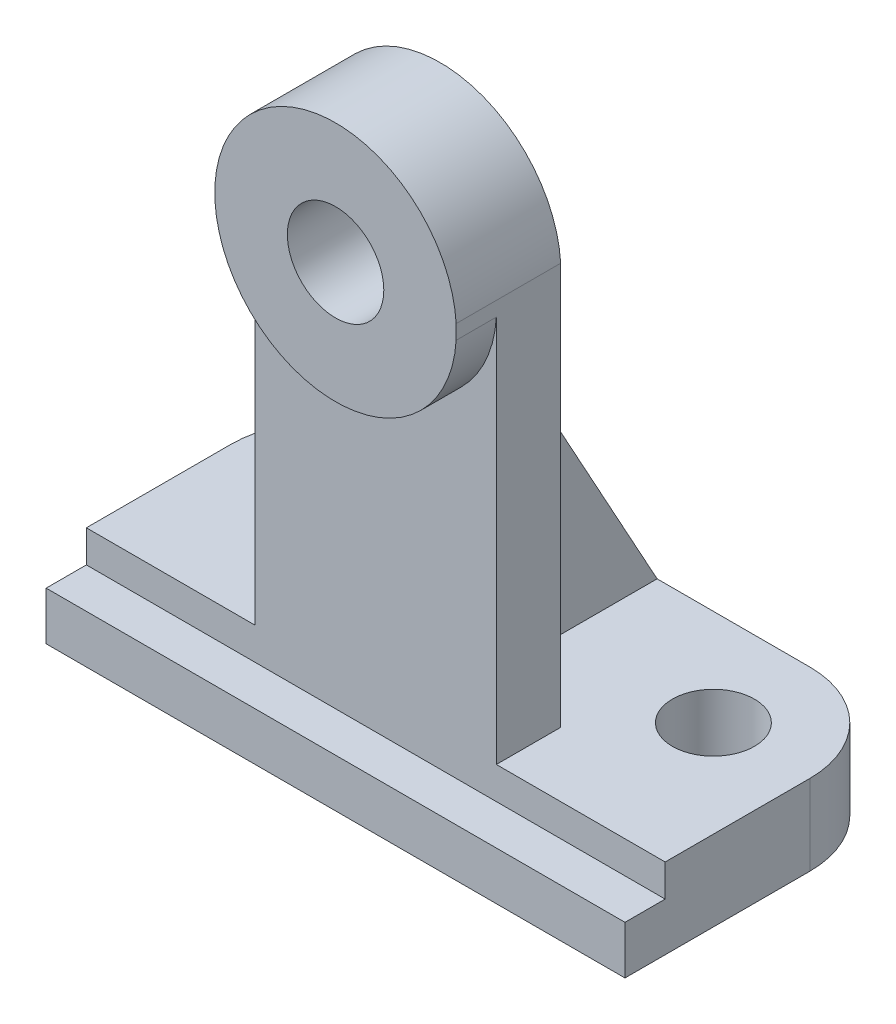
ISO-10303-21;
HEADER;
FILE_DESCRIPTION(('STEP AP214'),'2;1');
FILE_NAME('part.step','',(''),(''),'','','');
FILE_SCHEMA(('AUTOMOTIVE_DESIGN { 1 0 10303 214 1 1 1 1 }'));
ENDSEC;
DATA;
#1=APPLICATION_CONTEXT('core data for automotive mechanical design processes');
#2=APPLICATION_PROTOCOL_DEFINITION('international standard','automotive_design',2000,#1);
#3=PRODUCT_CONTEXT('',#1,'mechanical');
#4=PRODUCT('Part','Part','',(#3));
#5=PRODUCT_RELATED_PRODUCT_CATEGORY('part','',(#4));
#6=PRODUCT_DEFINITION_FORMATION('','',#4);
#7=PRODUCT_DEFINITION_CONTEXT('part definition',#1,'design');
#8=PRODUCT_DEFINITION('design','',#6,#7);
#9=PRODUCT_DEFINITION_SHAPE('','',#8);
#10=(LENGTH_UNIT() NAMED_UNIT(*) SI_UNIT(.MILLI.,.METRE.));
#11=(NAMED_UNIT(*) PLANE_ANGLE_UNIT() SI_UNIT($,.RADIAN.));
#12=(NAMED_UNIT(*) SI_UNIT($,.STERADIAN.) SOLID_ANGLE_UNIT());
#13=UNCERTAINTY_MEASURE_WITH_UNIT(LENGTH_MEASURE(1.E-05),#10,'distance_accuracy_value','');
#14=(GEOMETRIC_REPRESENTATION_CONTEXT(3) GLOBAL_UNCERTAINTY_ASSIGNED_CONTEXT((#13)) GLOBAL_UNIT_ASSIGNED_CONTEXT((#10,
#11,#12)) REPRESENTATION_CONTEXT('',''));
#15=CARTESIAN_POINT('',(0.,0.,0.));
#16=DIRECTION('',(0.,0.,1.));
#17=DIRECTION('',(1.,0.,0.));
#18=AXIS2_PLACEMENT_3D('',#15,#16,#17);
#19=CARTESIAN_POINT('',(-36.,0.,-35.));
#20=DIRECTION('',(0.,1.,0.));
#21=DIRECTION('',(-1.,0.,0.));
#22=AXIS2_PLACEMENT_3D('',#19,#20,#21);
#23=PLANE('',#22);
#24=CARTESIAN_POINT('',(24.,0.,-23.));
#25=DIRECTION('',(0.,1.,0.));
#26=DIRECTION('',(0.,0.,1.));
#27=AXIS2_PLACEMENT_3D('',#24,#25,#26);
#28=CIRCLE('',#27,5.1);
#29=CARTESIAN_POINT('',(24.,0.,-17.9));
#30=VERTEX_POINT('',#29);
#31=EDGE_CURVE('E347',#30,#30,#28,.T.);
#32=ORIENTED_EDGE('',*,*,#31,.F.);
#33=EDGE_LOOP('',(#32));
#34=FACE_BOUND('',#33,.T.);
#35=DIRECTION('',(0.,0.,1.));
#36=VECTOR('',#35,1.);
#37=CARTESIAN_POINT('',(36.,0.,-35.));
#38=LINE('',#37,#36);
#39=CARTESIAN_POINT('',(36.,0.,-22.9999999999999));
#40=VERTEX_POINT('',#39);
#41=CARTESIAN_POINT('',(36.,0.,-5.));
#42=VERTEX_POINT('',#41);
#43=EDGE_CURVE('E55',#40,#42,#38,.T.);
#44=ORIENTED_EDGE('',*,*,#43,.F.);
#45=CARTESIAN_POINT('',(24.,0.,-23.));
#46=DIRECTION('',(0.,1.,0.));
#47=DIRECTION('',(0.,0.,1.));
#48=AXIS2_PLACEMENT_3D('',#45,#46,#47);
#49=CIRCLE('',#48,12.);
#50=CARTESIAN_POINT('',(23.9999999999999,0.,-35.));
#51=VERTEX_POINT('',#50);
#52=EDGE_CURVE('E167',#40,#51,#49,.T.);
#53=ORIENTED_EDGE('',*,*,#52,.T.);
#54=DIRECTION('',(-1.,0.,0.));
#55=VECTOR('',#54,1.);
#56=CARTESIAN_POINT('',(-36.,0.,-35.));
#57=LINE('',#56,#55);
#58=CARTESIAN_POINT('',(5.,0.,-35.));
#59=VERTEX_POINT('',#58);
#60=EDGE_CURVE('E198',#51,#59,#57,.T.);
#61=ORIENTED_EDGE('',*,*,#60,.T.);
#62=DIRECTION('',(0.,0.,1.));
#63=VECTOR('',#62,1.);
#64=CARTESIAN_POINT('',(5.,0.,-35.));
#65=LINE('',#64,#63);
#66=CARTESIAN_POINT('',(5.,0.,-13.));
#67=VERTEX_POINT('',#66);
#68=EDGE_CURVE('E324',#59,#67,#65,.T.);
#69=ORIENTED_EDGE('',*,*,#68,.T.);
#70=DIRECTION('',(1.,0.,0.));
#71=VECTOR('',#70,1.);
#72=CARTESIAN_POINT('',(0.,0.,-13.));
#73=LINE('',#72,#71);
#74=CARTESIAN_POINT('',(15.,0.,-13.));
#75=VERTEX_POINT('',#74);
#76=EDGE_CURVE('E267',#67,#75,#73,.T.);
#77=ORIENTED_EDGE('',*,*,#76,.T.);
#78=DIRECTION('',(0.,0.,1.));
#79=VECTOR('',#78,1.);
#80=CARTESIAN_POINT('',(15.,0.,-13.));
#81=LINE('',#80,#79);
#82=CARTESIAN_POINT('',(15.,0.,-5.));
#83=VERTEX_POINT('',#82);
#84=EDGE_CURVE('E234',#75,#83,#81,.T.);
#85=ORIENTED_EDGE('',*,*,#84,.T.);
#86=DIRECTION('',(1.,0.,0.));
#87=VECTOR('',#86,1.);
#88=CARTESIAN_POINT('',(-36.,0.,-5.));
#89=LINE('',#88,#87);
#90=EDGE_CURVE('E221',#83,#42,#89,.T.);
#91=ORIENTED_EDGE('',*,*,#90,.T.);
#92=EDGE_LOOP('',(#44,#53,#61,#69,#77,#85,#91));
#93=FACE_BOUND('',#92,.T.);
#94=ADVANCED_FACE('F45',(#34,#93),#23,.T.);
#95=CARTESIAN_POINT('',(-36.,-10.,-35.));
#96=DIRECTION('',(-1.,0.,0.));
#97=DIRECTION('',(0.,0.,1.));
#98=AXIS2_PLACEMENT_3D('',#95,#96,#97);
#99=PLANE('',#98);
#100=DIRECTION('',(0.,0.,1.));
#101=VECTOR('',#100,1.);
#102=CARTESIAN_POINT('',(-36.,0.,-35.));
#103=LINE('',#102,#101);
#104=CARTESIAN_POINT('',(-36.,0.,-22.9999999999999));
#105=VERTEX_POINT('',#104);
#106=CARTESIAN_POINT('',(-36.,0.,-5.));
#107=VERTEX_POINT('',#106);
#108=EDGE_CURVE('E12',#105,#107,#103,.T.);
#109=ORIENTED_EDGE('',*,*,#108,.F.);
#110=DIRECTION('',(0.,1.,0.));
#111=VECTOR('',#110,1.);
#112=CARTESIAN_POINT('',(-36.,-10.,-22.9999999999999));
#113=LINE('',#112,#111);
#114=CARTESIAN_POINT('',(-36.,-10.,-22.9999999999999));
#115=VERTEX_POINT('',#114);
#116=EDGE_CURVE('E331',#115,#105,#113,.T.);
#117=ORIENTED_EDGE('',*,*,#116,.F.);
#118=DIRECTION('',(0.,0.,1.));
#119=VECTOR('',#118,1.);
#120=CARTESIAN_POINT('',(-36.,-10.,-35.));
#121=LINE('',#120,#119);
#122=CARTESIAN_POINT('',(-36.,-10.,0.));
#123=VERTEX_POINT('',#122);
#124=EDGE_CURVE('E191',#115,#123,#121,.T.);
#125=ORIENTED_EDGE('',*,*,#124,.T.);
#126=DIRECTION('',(0.,-1.,0.));
#127=VECTOR('',#126,1.);
#128=CARTESIAN_POINT('',(-36.,-10.,0.));
#129=LINE('',#128,#127);
#130=CARTESIAN_POINT('',(-36.,-3.99999999999999,0.));
#131=VERTEX_POINT('',#130);
#132=EDGE_CURVE('E204',#131,#123,#129,.T.);
#133=ORIENTED_EDGE('',*,*,#132,.F.);
#134=DIRECTION('',(0.,0.,-1.));
#135=VECTOR('',#134,1.);
#136=CARTESIAN_POINT('',(-36.,-3.99999999999999,0.));
#137=LINE('',#136,#135);
#138=CARTESIAN_POINT('',(-36.,-3.99999999999999,-5.));
#139=VERTEX_POINT('',#138);
#140=EDGE_CURVE('E229',#131,#139,#137,.T.);
#141=ORIENTED_EDGE('',*,*,#140,.T.);
#142=DIRECTION('',(0.,1.,0.));
#143=VECTOR('',#142,1.);
#144=CARTESIAN_POINT('',(-36.,-3.99999999999999,-5.));
#145=LINE('',#144,#143);
#146=EDGE_CURVE('E218',#139,#107,#145,.T.);
#147=ORIENTED_EDGE('',*,*,#146,.T.);
#148=EDGE_LOOP('',(#109,#117,#125,#133,#141,#147));
#149=FACE_BOUND('',#148,.T.);
#150=ADVANCED_FACE('F47',(#149),#99,.T.);
#151=CARTESIAN_POINT('',(-24.,0.,-23.));
#152=DIRECTION('',(0.,1.,0.));
#153=DIRECTION('',(0.,0.,1.));
#154=AXIS2_PLACEMENT_3D('',#151,#152,#153);
#155=CIRCLE('',#154,5.1);
#156=CARTESIAN_POINT('',(-24.,0.,-17.9));
#157=VERTEX_POINT('',#156);
#158=EDGE_CURVE('E355',#157,#157,#155,.T.);
#159=ORIENTED_EDGE('',*,*,#158,.F.);
#160=EDGE_LOOP('',(#159));
#161=FACE_BOUND('',#160,.T.);
#162=CARTESIAN_POINT('',(-24.,0.,-23.));
#163=DIRECTION('',(0.,1.,0.));
#164=DIRECTION('',(0.,0.,1.));
#165=AXIS2_PLACEMENT_3D('',#162,#163,#164);
#166=CIRCLE('',#165,12.);
#167=CARTESIAN_POINT('',(-23.9999999999999,0.,-35.));
#168=VERTEX_POINT('',#167);
#169=EDGE_CURVE('E71',#105,#168,#166,.F.);
#170=ORIENTED_EDGE('',*,*,#169,.F.);
#171=ORIENTED_EDGE('',*,*,#108,.T.);
#172=CARTESIAN_POINT('',(-15.,0.,-5.));
#173=VERTEX_POINT('',#172);
#174=EDGE_CURVE('E208',#107,#173,#89,.T.);
#175=ORIENTED_EDGE('',*,*,#174,.T.);
#176=DIRECTION('',(0.,0.,1.));
#177=VECTOR('',#176,1.);
#178=CARTESIAN_POINT('',(-15.,0.,-13.));
#179=LINE('',#178,#177);
#180=CARTESIAN_POINT('',(-15.,0.,-13.));
#181=VERTEX_POINT('',#180);
#182=EDGE_CURVE('E241',#181,#173,#179,.T.);
#183=ORIENTED_EDGE('',*,*,#182,.F.);
#184=CARTESIAN_POINT('',(-5.,0.,-13.));
#185=VERTEX_POINT('',#184);
#186=EDGE_CURVE('E263',#181,#185,#73,.T.);
#187=ORIENTED_EDGE('',*,*,#186,.T.);
#188=DIRECTION('',(0.,0.,1.));
#189=VECTOR('',#188,1.);
#190=CARTESIAN_POINT('',(-5.,0.,-35.));
#191=LINE('',#190,#189);
#192=CARTESIAN_POINT('',(-5.,0.,-35.));
#193=VERTEX_POINT('',#192);
#194=EDGE_CURVE('E314',#193,#185,#191,.T.);
#195=ORIENTED_EDGE('',*,*,#194,.F.);
#196=EDGE_CURVE('E211',#193,#168,#57,.T.);
#197=ORIENTED_EDGE('',*,*,#196,.T.);
#198=EDGE_LOOP('',(#170,#171,#175,#183,#187,#195,#197));
#199=FACE_BOUND('',#198,.T.);
#200=ADVANCED_FACE('F372',(#161,#199),#23,.T.);
#201=CARTESIAN_POINT('',(36.,0.,-35.));
#202=DIRECTION('',(1.,0.,0.));
#203=DIRECTION('',(0.,0.,-1.));
#204=AXIS2_PLACEMENT_3D('',#201,#202,#203);
#205=PLANE('',#204);
#206=DIRECTION('',(0.,0.,1.));
#207=VECTOR('',#206,1.);
#208=CARTESIAN_POINT('',(36.,-9.99999999999999,-35.));
#209=LINE('',#208,#207);
#210=CARTESIAN_POINT('',(36.,-10.,-22.9999999999999));
#211=VERTEX_POINT('',#210);
#212=CARTESIAN_POINT('',(36.,-9.99999999999999,0.));
#213=VERTEX_POINT('',#212);
#214=EDGE_CURVE('E178',#211,#213,#209,.T.);
#215=ORIENTED_EDGE('',*,*,#214,.F.);
#216=DIRECTION('',(0.,1.,0.));
#217=VECTOR('',#216,1.);
#218=CARTESIAN_POINT('',(36.,-10.,-22.9999999999999));
#219=LINE('',#218,#217);
#220=EDGE_CURVE('E164',#211,#40,#219,.T.);
#221=ORIENTED_EDGE('',*,*,#220,.T.);
#222=ORIENTED_EDGE('',*,*,#43,.T.);
#223=DIRECTION('',(0.,1.,0.));
#224=VECTOR('',#223,1.);
#225=CARTESIAN_POINT('',(36.,-3.99999999999999,-5.));
#226=LINE('',#225,#224);
#227=CARTESIAN_POINT('',(36.,-3.99999999999999,-5.));
#228=VERTEX_POINT('',#227);
#229=EDGE_CURVE('E225',#228,#42,#226,.T.);
#230=ORIENTED_EDGE('',*,*,#229,.F.);
#231=DIRECTION('',(0.,0.,-1.));
#232=VECTOR('',#231,1.);
#233=CARTESIAN_POINT('',(36.,-3.99999999999999,0.));
#234=LINE('',#233,#232);
#235=CARTESIAN_POINT('',(36.,-3.99999999999999,0.));
#236=VERTEX_POINT('',#235);
#237=EDGE_CURVE('E230',#236,#228,#234,.T.);
#238=ORIENTED_EDGE('',*,*,#237,.F.);
#239=DIRECTION('',(0.,1.,0.));
#240=VECTOR('',#239,1.);
#241=CARTESIAN_POINT('',(36.,0.,0.));
#242=LINE('',#241,#240);
#243=EDGE_CURVE('E188',#213,#236,#242,.T.);
#244=ORIENTED_EDGE('',*,*,#243,.F.);
#245=EDGE_LOOP('',(#215,#221,#222,#230,#238,#244));
#246=FACE_BOUND('',#245,.T.);
#247=ADVANCED_FACE('F185',(#246),#205,.T.);
#248=CARTESIAN_POINT('',(36.,-9.99999999999999,-35.));
#249=DIRECTION('',(0.,-1.,0.));
#250=DIRECTION('',(1.,0.,0.));
#251=AXIS2_PLACEMENT_3D('',#248,#249,#250);
#252=PLANE('',#251);
#253=CARTESIAN_POINT('',(-24.,-10.,-23.));
#254=DIRECTION('',(0.,1.,0.));
#255=DIRECTION('',(0.,0.,1.));
#256=AXIS2_PLACEMENT_3D('',#253,#254,#255);
#257=CIRCLE('',#256,5.1);
#258=CARTESIAN_POINT('',(-24.,-10.,-17.9));
#259=VERTEX_POINT('',#258);
#260=EDGE_CURVE('E340',#259,#259,#257,.T.);
#261=ORIENTED_EDGE('',*,*,#260,.T.);
#262=EDGE_LOOP('',(#261));
#263=FACE_BOUND('',#262,.T.);
#264=CARTESIAN_POINT('',(24.,-10.,-23.));
#265=DIRECTION('',(0.,1.,0.));
#266=DIRECTION('',(0.,0.,1.));
#267=AXIS2_PLACEMENT_3D('',#264,#265,#266);
#268=CIRCLE('',#267,5.1);
#269=CARTESIAN_POINT('',(24.,-10.,-17.9));
#270=VERTEX_POINT('',#269);
#271=EDGE_CURVE('E351',#270,#270,#268,.T.);
#272=ORIENTED_EDGE('',*,*,#271,.T.);
#273=EDGE_LOOP('',(#272));
#274=FACE_BOUND('',#273,.T.);
#275=DIRECTION('',(1.,0.,0.));
#276=VECTOR('',#275,1.);
#277=CARTESIAN_POINT('',(36.,-9.99999999999999,-35.));
#278=LINE('',#277,#276);
#279=CARTESIAN_POINT('',(-23.9999999999999,-10.,-35.));
#280=VERTEX_POINT('',#279);
#281=CARTESIAN_POINT('',(23.9999999999999,-9.99999999999999,-35.));
#282=VERTEX_POINT('',#281);
#283=EDGE_CURVE('E182',#280,#282,#278,.T.);
#284=ORIENTED_EDGE('',*,*,#283,.T.);
#285=CARTESIAN_POINT('',(24.,-10.,-23.));
#286=DIRECTION('',(0.,1.,0.));
#287=DIRECTION('',(0.,0.,1.));
#288=AXIS2_PLACEMENT_3D('',#285,#286,#287);
#289=CIRCLE('',#288,12.);
#290=EDGE_CURVE('E63',#211,#282,#289,.T.);
#291=ORIENTED_EDGE('',*,*,#290,.F.);
#292=ORIENTED_EDGE('',*,*,#214,.T.);
#293=DIRECTION('',(1.,0.,0.));
#294=VECTOR('',#293,1.);
#295=CARTESIAN_POINT('',(36.,-9.99999999999999,0.));
#296=LINE('',#295,#294);
#297=EDGE_CURVE('E202',#123,#213,#296,.T.);
#298=ORIENTED_EDGE('',*,*,#297,.F.);
#299=ORIENTED_EDGE('',*,*,#124,.F.);
#300=CARTESIAN_POINT('',(-24.,-10.,-23.));
#301=DIRECTION('',(0.,1.,0.));
#302=DIRECTION('',(0.,0.,1.));
#303=AXIS2_PLACEMENT_3D('',#300,#301,#302);
#304=CIRCLE('',#303,12.);
#305=EDGE_CURVE('E335',#115,#280,#304,.F.);
#306=ORIENTED_EDGE('',*,*,#305,.T.);
#307=EDGE_LOOP('',(#284,#291,#292,#298,#299,#306));
#308=FACE_BOUND('',#307,.T.);
#309=ADVANCED_FACE('F176',(#263,#274,#308),#252,.T.);
#310=CARTESIAN_POINT('',(0.,0.,-13.));
#311=DIRECTION('',(0.,0.,1.));
#312=DIRECTION('',(1.,0.,0.));
#313=AXIS2_PLACEMENT_3D('',#310,#311,#312);
#314=PLANE('',#313);
#315=CARTESIAN_POINT('',(0.,49.099821292408,-13.));
#316=DIRECTION('',(0.,0.,1.));
#317=DIRECTION('',(1.,0.,0.));
#318=AXIS2_PLACEMENT_3D('',#315,#316,#317);
#319=CIRCLE('',#318,6.);
#320=CARTESIAN_POINT('',(6.00000000000005,49.099821292408,-13.));
#321=VERTEX_POINT('',#320);
#322=EDGE_CURVE('E295',#321,#321,#319,.T.);
#323=ORIENTED_EDGE('',*,*,#322,.T.);
#324=EDGE_LOOP('',(#323));
#325=FACE_BOUND('',#324,.T.);
#326=DIRECTION('',(0.,1.,0.));
#327=VECTOR('',#326,1.);
#328=CARTESIAN_POINT('',(5.,0.,-13.));
#329=LINE('',#328,#327);
#330=CARTESIAN_POINT('',(5.,40.,-13.));
#331=VERTEX_POINT('',#330);
#332=EDGE_CURVE('E305',#67,#331,#329,.T.);
#333=ORIENTED_EDGE('',*,*,#332,.T.);
#334=DIRECTION('',(-1.,0.,0.));
#335=VECTOR('',#334,1.);
#336=CARTESIAN_POINT('',(5.,40.,-13.));
#337=LINE('',#336,#335);
#338=CARTESIAN_POINT('',(-5.,40.,-13.));
#339=VERTEX_POINT('',#338);
#340=EDGE_CURVE('E304',#331,#339,#337,.T.);
#341=ORIENTED_EDGE('',*,*,#340,.T.);
#342=DIRECTION('',(0.,1.,0.));
#343=VECTOR('',#342,1.);
#344=CARTESIAN_POINT('',(-5.,0.,-13.));
#345=LINE('',#344,#343);
#346=EDGE_CURVE('E309',#185,#339,#345,.T.);
#347=ORIENTED_EDGE('',*,*,#346,.F.);
#348=ORIENTED_EDGE('',*,*,#186,.F.);
#349=DIRECTION('',(0.,1.,0.));
#350=VECTOR('',#349,1.);
#351=CARTESIAN_POINT('',(-15.,0.,-13.));
#352=LINE('',#351,#350);
#353=CARTESIAN_POINT('',(-15.,50.,-13.));
#354=VERTEX_POINT('',#353);
#355=EDGE_CURVE('E251',#181,#354,#352,.T.);
#356=ORIENTED_EDGE('',*,*,#355,.T.);
#357=CARTESIAN_POINT('',(0.,49.099821292408,-13.));
#358=DIRECTION('',(0.,0.,1.));
#359=DIRECTION('',(1.,0.,0.));
#360=AXIS2_PLACEMENT_3D('',#357,#358,#359);
#361=CIRCLE('',#360,15.0269864479078);
#362=CARTESIAN_POINT('',(15.,50.0000000000018,-13.));
#363=VERTEX_POINT('',#362);
#364=EDGE_CURVE('E274',#363,#354,#361,.T.);
#365=ORIENTED_EDGE('',*,*,#364,.F.);
#366=DIRECTION('',(0.,-1.,0.));
#367=VECTOR('',#366,1.);
#368=CARTESIAN_POINT('',(15.,0.,-13.));
#369=LINE('',#368,#367);
#370=EDGE_CURVE('E244',#363,#75,#369,.T.);
#371=ORIENTED_EDGE('',*,*,#370,.T.);
#372=ORIENTED_EDGE('',*,*,#76,.F.);
#373=EDGE_LOOP('',(#333,#341,#347,#348,#356,#365,#371,#372));
#374=FACE_BOUND('',#373,.T.);
#375=ADVANCED_FACE('F398',(#325,#374),#314,.F.);
#376=CARTESIAN_POINT('',(0.,0.,-35.));
#377=DIRECTION('',(0.,0.,-1.));
#378=DIRECTION('',(-1.,0.,0.));
#379=AXIS2_PLACEMENT_3D('',#376,#377,#378);
#380=PLANE('',#379);
#381=DIRECTION('',(0.,1.,0.));
#382=VECTOR('',#381,1.);
#383=CARTESIAN_POINT('',(23.9999999999999,-10.,-35.));
#384=LINE('',#383,#382);
#385=EDGE_CURVE('E172',#282,#51,#384,.T.);
#386=ORIENTED_EDGE('',*,*,#385,.F.);
#387=ORIENTED_EDGE('',*,*,#283,.F.);
#388=DIRECTION('',(0.,1.,0.));
#389=VECTOR('',#388,1.);
#390=CARTESIAN_POINT('',(-23.9999999999999,-10.,-35.));
#391=LINE('',#390,#389);
#392=EDGE_CURVE('E334',#280,#168,#391,.T.);
#393=ORIENTED_EDGE('',*,*,#392,.T.);
#394=ORIENTED_EDGE('',*,*,#196,.F.);
#395=DIRECTION('',(-1.,0.,0.));
#396=VECTOR('',#395,1.);
#397=CARTESIAN_POINT('',(5.,0.,-35.));
#398=LINE('',#397,#396);
#399=EDGE_CURVE('E302',#59,#193,#398,.T.);
#400=ORIENTED_EDGE('',*,*,#399,.F.);
#401=ORIENTED_EDGE('',*,*,#60,.F.);
#402=EDGE_LOOP('',(#386,#387,#393,#394,#400,#401));
#403=FACE_BOUND('',#402,.T.);
#404=ADVANCED_FACE('F403',(#403),#380,.T.);
#405=CARTESIAN_POINT('',(0.,0.,0.));
#406=DIRECTION('',(0.,0.,-1.));
#407=DIRECTION('',(-1.,0.,0.));
#408=AXIS2_PLACEMENT_3D('',#405,#406,#407);
#409=PLANE('',#408);
#410=ORIENTED_EDGE('',*,*,#243,.T.);
#411=DIRECTION('',(1.,0.,0.));
#412=VECTOR('',#411,1.);
#413=CARTESIAN_POINT('',(-36.,-3.99999999999999,0.));
#414=LINE('',#413,#412);
#415=EDGE_CURVE('E214',#131,#236,#414,.T.);
#416=ORIENTED_EDGE('',*,*,#415,.F.);
#417=ORIENTED_EDGE('',*,*,#132,.T.);
#418=ORIENTED_EDGE('',*,*,#297,.T.);
#419=EDGE_LOOP('',(#410,#416,#417,#418));
#420=FACE_BOUND('',#419,.T.);
#421=ADVANCED_FACE('F418',(#420),#409,.F.);
#422=CARTESIAN_POINT('',(-36.,-3.99999999999999,-5.));
#423=DIRECTION('',(0.,0.,-1.));
#424=DIRECTION('',(-1.,0.,0.));
#425=AXIS2_PLACEMENT_3D('',#422,#423,#424);
#426=PLANE('',#425);
#427=ORIENTED_EDGE('',*,*,#229,.T.);
#428=ORIENTED_EDGE('',*,*,#90,.F.);
#429=DIRECTION('',(0.,-1.,0.));
#430=VECTOR('',#429,1.);
#431=CARTESIAN_POINT('',(15.,0.,-5.));
#432=LINE('',#431,#430);
#433=CARTESIAN_POINT('',(15.,48.1996425848141,-5.));
#434=VERTEX_POINT('',#433);
#435=EDGE_CURVE('E248',#434,#83,#432,.T.);
#436=ORIENTED_EDGE('',*,*,#435,.F.);
#437=CARTESIAN_POINT('',(0.,49.099821292408,-5.));
#438=DIRECTION('',(0.,0.,1.));
#439=DIRECTION('',(1.,0.,0.));
#440=AXIS2_PLACEMENT_3D('',#437,#438,#439);
#441=CIRCLE('',#440,15.0269864479078);
#442=CARTESIAN_POINT('',(-15.,48.1996425848158,-5.));
#443=VERTEX_POINT('',#442);
#444=EDGE_CURVE('E256',#443,#434,#441,.T.);
#445=ORIENTED_EDGE('',*,*,#444,.F.);
#446=DIRECTION('',(0.,1.,0.));
#447=VECTOR('',#446,1.);
#448=CARTESIAN_POINT('',(-15.,0.,-5.));
#449=LINE('',#448,#447);
#450=EDGE_CURVE('E252',#173,#443,#449,.T.);
#451=ORIENTED_EDGE('',*,*,#450,.F.);
#452=ORIENTED_EDGE('',*,*,#174,.F.);
#453=ORIENTED_EDGE('',*,*,#146,.F.);
#454=DIRECTION('',(1.,0.,0.));
#455=VECTOR('',#454,1.);
#456=CARTESIAN_POINT('',(-36.,-3.99999999999999,-5.));
#457=LINE('',#456,#455);
#458=EDGE_CURVE('E217',#139,#228,#457,.T.);
#459=ORIENTED_EDGE('',*,*,#458,.T.);
#460=EDGE_LOOP('',(#427,#428,#436,#445,#451,#452,#453,#459));
#461=FACE_BOUND('',#460,.T.);
#462=ADVANCED_FACE('F387',(#461),#426,.F.);
#463=CARTESIAN_POINT('',(-36.,-3.99999999999999,0.));
#464=DIRECTION('',(0.,-1.,0.));
#465=DIRECTION('',(0.,0.,-1.));
#466=AXIS2_PLACEMENT_3D('',#463,#464,#465);
#467=PLANE('',#466);
#468=ORIENTED_EDGE('',*,*,#237,.T.);
#469=ORIENTED_EDGE('',*,*,#458,.F.);
#470=ORIENTED_EDGE('',*,*,#140,.F.);
#471=ORIENTED_EDGE('',*,*,#415,.T.);
#472=EDGE_LOOP('',(#468,#469,#470,#471));
#473=FACE_BOUND('',#472,.T.);
#474=ADVANCED_FACE('F464',(#473),#467,.F.);
#475=CARTESIAN_POINT('',(15.,0.,-13.));
#476=DIRECTION('',(-1.,0.,0.));
#477=DIRECTION('',(0.,-1.,0.));
#478=AXIS2_PLACEMENT_3D('',#475,#476,#477);
#479=PLANE('',#478);
#480=ORIENTED_EDGE('',*,*,#435,.T.);
#481=ORIENTED_EDGE('',*,*,#84,.F.);
#482=ORIENTED_EDGE('',*,*,#370,.F.);
#483=DIRECTION('',(0.,0.,1.));
#484=VECTOR('',#483,1.);
#485=CARTESIAN_POINT('',(15.,50.0000000000018,-13.));
#486=LINE('',#485,#484);
#487=CARTESIAN_POINT('',(15.,50.0000000000018,0.));
#488=VERTEX_POINT('',#487);
#489=EDGE_CURVE('E270',#363,#488,#486,.T.);
#490=ORIENTED_EDGE('',*,*,#489,.T.);
#491=DIRECTION('',(0.,-1.,0.));
#492=VECTOR('',#491,1.);
#493=CARTESIAN_POINT('',(15.,0.,0.));
#494=LINE('',#493,#492);
#495=CARTESIAN_POINT('',(15.,48.1996425848141,0.));
#496=VERTEX_POINT('',#495);
#497=EDGE_CURVE('E291',#488,#496,#494,.T.);
#498=ORIENTED_EDGE('',*,*,#497,.T.);
#499=DIRECTION('',(0.,0.,1.));
#500=VECTOR('',#499,1.);
#501=CARTESIAN_POINT('',(15.,48.1996425848141,-13.));
#502=LINE('',#501,#500);
#503=EDGE_CURVE('E259',#434,#496,#502,.T.);
#504=ORIENTED_EDGE('',*,*,#503,.F.);
#505=EDGE_LOOP('',(#480,#481,#482,#490,#498,#504));
#506=FACE_BOUND('',#505,.T.);
#507=ADVANCED_FACE('F461',(#506),#479,.F.);
#508=CARTESIAN_POINT('',(-15.,0.,-13.));
#509=DIRECTION('',(1.,0.,0.));
#510=DIRECTION('',(0.,0.,-1.));
#511=AXIS2_PLACEMENT_3D('',#508,#509,#510);
#512=PLANE('',#511);
#513=ORIENTED_EDGE('',*,*,#450,.T.);
#514=DIRECTION('',(0.,0.,1.));
#515=VECTOR('',#514,1.);
#516=CARTESIAN_POINT('',(-15.,48.1996425848158,-13.));
#517=LINE('',#516,#515);
#518=CARTESIAN_POINT('',(-15.,48.1996425848158,0.));
#519=VERTEX_POINT('',#518);
#520=EDGE_CURVE('E277',#443,#519,#517,.T.);
#521=ORIENTED_EDGE('',*,*,#520,.T.);
#522=DIRECTION('',(0.,1.,0.));
#523=VECTOR('',#522,1.);
#524=CARTESIAN_POINT('',(-15.,0.,0.));
#525=LINE('',#524,#523);
#526=CARTESIAN_POINT('',(-15.,50.,0.));
#527=VERTEX_POINT('',#526);
#528=EDGE_CURVE('E282',#519,#527,#525,.T.);
#529=ORIENTED_EDGE('',*,*,#528,.T.);
#530=DIRECTION('',(0.,0.,1.));
#531=VECTOR('',#530,1.);
#532=CARTESIAN_POINT('',(-15.,50.,-13.));
#533=LINE('',#532,#531);
#534=EDGE_CURVE('E273',#354,#527,#533,.T.);
#535=ORIENTED_EDGE('',*,*,#534,.F.);
#536=ORIENTED_EDGE('',*,*,#355,.F.);
#537=ORIENTED_EDGE('',*,*,#182,.T.);
#538=EDGE_LOOP('',(#513,#521,#529,#535,#536,#537));
#539=FACE_BOUND('',#538,.T.);
#540=ADVANCED_FACE('F393',(#539),#512,.F.);
#541=CARTESIAN_POINT('',(0.,49.099821292408,-13.));
#542=DIRECTION('',(0.,0.,1.));
#543=DIRECTION('',(1.,0.,0.));
#544=AXIS2_PLACEMENT_3D('',#541,#542,#543);
#545=CYLINDRICAL_SURFACE('',#544,15.0269864479078);
#546=ORIENTED_EDGE('',*,*,#444,.T.);
#547=ORIENTED_EDGE('',*,*,#503,.T.);
#548=CARTESIAN_POINT('',(0.,49.099821292408,0.));
#549=DIRECTION('',(0.,0.,1.));
#550=DIRECTION('',(1.,0.,0.));
#551=AXIS2_PLACEMENT_3D('',#548,#549,#550);
#552=CIRCLE('',#551,15.0269864479078);
#553=EDGE_CURVE('E286',#519,#496,#552,.T.);
#554=ORIENTED_EDGE('',*,*,#553,.F.);
#555=ORIENTED_EDGE('',*,*,#520,.F.);
#556=EDGE_LOOP('',(#546,#547,#554,#555));
#557=FACE_BOUND('',#556,.T.);
#558=ADVANCED_FACE('F459',(#557),#545,.T.);
#559=EDGE_CURVE('E287',#488,#527,#552,.T.);
#560=ORIENTED_EDGE('',*,*,#559,.F.);
#561=ORIENTED_EDGE('',*,*,#489,.F.);
#562=ORIENTED_EDGE('',*,*,#364,.T.);
#563=ORIENTED_EDGE('',*,*,#534,.T.);
#564=EDGE_LOOP('',(#560,#561,#562,#563));
#565=FACE_BOUND('',#564,.T.);
#566=ADVANCED_FACE('F487',(#565),#545,.T.);
#567=CARTESIAN_POINT('',(0.,0.,0.));
#568=DIRECTION('',(0.,0.,1.));
#569=DIRECTION('',(1.,0.,0.));
#570=AXIS2_PLACEMENT_3D('',#567,#568,#569);
#571=PLANE('',#570);
#572=CARTESIAN_POINT('',(0.,49.099821292408,0.));
#573=DIRECTION('',(0.,0.,1.));
#574=DIRECTION('',(1.,0.,0.));
#575=AXIS2_PLACEMENT_3D('',#572,#573,#574);
#576=CIRCLE('',#575,6.);
#577=CARTESIAN_POINT('',(6.00000000000005,49.099821292408,0.));
#578=VERTEX_POINT('',#577);
#579=EDGE_CURVE('E49',#578,#578,#576,.T.);
#580=ORIENTED_EDGE('',*,*,#579,.F.);
#581=EDGE_LOOP('',(#580));
#582=FACE_BOUND('',#581,.T.);
#583=ORIENTED_EDGE('',*,*,#497,.F.);
#584=ORIENTED_EDGE('',*,*,#559,.T.);
#585=ORIENTED_EDGE('',*,*,#528,.F.);
#586=ORIENTED_EDGE('',*,*,#553,.T.);
#587=EDGE_LOOP('',(#583,#584,#585,#586));
#588=FACE_BOUND('',#587,.T.);
#589=ADVANCED_FACE('F434',(#582,#588),#571,.T.);
#590=CARTESIAN_POINT('',(0.,49.099821292408,-35.));
#591=DIRECTION('',(0.,0.,1.));
#592=DIRECTION('',(1.,0.,0.));
#593=AXIS2_PLACEMENT_3D('',#590,#591,#592);
#594=CYLINDRICAL_SURFACE('',#593,6.);
#595=ORIENTED_EDGE('',*,*,#579,.T.);
#596=EDGE_LOOP('',(#595));
#597=FACE_BOUND('',#596,.T.);
#598=ORIENTED_EDGE('',*,*,#322,.F.);
#599=EDGE_LOOP('',(#598));
#600=FACE_BOUND('',#599,.T.);
#601=ADVANCED_FACE('F427',(#597,#600),#594,.F.);
#602=CARTESIAN_POINT('',(5.,40.,-13.));
#603=DIRECTION('',(0.,0.481918749772156,-0.876215908676647));
#604=DIRECTION('',(0.,0.876215908676647,0.481918749772156));
#605=AXIS2_PLACEMENT_3D('',#602,#603,#604);
#606=PLANE('',#605);
#607=DIRECTION('',(0.,-0.876215908676647,-0.481918749772156));
#608=VECTOR('',#607,1.);
#609=CARTESIAN_POINT('',(-5.,40.,-13.));
#610=LINE('',#609,#608);
#611=EDGE_CURVE('E317',#339,#193,#610,.T.);
#612=ORIENTED_EDGE('',*,*,#611,.F.);
#613=ORIENTED_EDGE('',*,*,#340,.F.);
#614=DIRECTION('',(0.,-0.876215908676647,-0.481918749772156));
#615=VECTOR('',#614,1.);
#616=CARTESIAN_POINT('',(5.,40.,-13.));
#617=LINE('',#616,#615);
#618=EDGE_CURVE('E313',#331,#59,#617,.T.);
#619=ORIENTED_EDGE('',*,*,#618,.T.);
#620=ORIENTED_EDGE('',*,*,#399,.T.);
#621=EDGE_LOOP('',(#612,#613,#619,#620));
#622=FACE_BOUND('',#621,.T.);
#623=ADVANCED_FACE('F425',(#622),#606,.T.);
#624=CARTESIAN_POINT('',(5.,0.,0.));
#625=DIRECTION('',(-1.,0.,0.));
#626=DIRECTION('',(0.,0.,1.));
#627=AXIS2_PLACEMENT_3D('',#624,#625,#626);
#628=PLANE('',#627);
#629=ORIENTED_EDGE('',*,*,#618,.F.);
#630=ORIENTED_EDGE('',*,*,#332,.F.);
#631=ORIENTED_EDGE('',*,*,#68,.F.);
#632=EDGE_LOOP('',(#629,#630,#631));
#633=FACE_BOUND('',#632,.T.);
#634=ADVANCED_FACE('F423',(#633),#628,.F.);
#635=CARTESIAN_POINT('',(-5.,0.,0.));
#636=DIRECTION('',(-1.,0.,0.));
#637=DIRECTION('',(0.,0.,1.));
#638=AXIS2_PLACEMENT_3D('',#635,#636,#637);
#639=PLANE('',#638);
#640=ORIENTED_EDGE('',*,*,#611,.T.);
#641=ORIENTED_EDGE('',*,*,#194,.T.);
#642=ORIENTED_EDGE('',*,*,#346,.T.);
#643=EDGE_LOOP('',(#640,#641,#642));
#644=FACE_BOUND('',#643,.T.);
#645=ADVANCED_FACE('F400',(#644),#639,.T.);
#646=CARTESIAN_POINT('',(-24.,-10.,-23.));
#647=DIRECTION('',(0.,1.,0.));
#648=DIRECTION('',(0.,0.,1.));
#649=AXIS2_PLACEMENT_3D('',#646,#647,#648);
#650=CYLINDRICAL_SURFACE('',#649,12.);
#651=ORIENTED_EDGE('',*,*,#169,.T.);
#652=ORIENTED_EDGE('',*,*,#392,.F.);
#653=ORIENTED_EDGE('',*,*,#305,.F.);
#654=ORIENTED_EDGE('',*,*,#116,.T.);
#655=EDGE_LOOP('',(#651,#652,#653,#654));
#656=FACE_BOUND('',#655,.T.);
#657=ADVANCED_FACE('F517',(#656),#650,.T.);
#658=CARTESIAN_POINT('',(24.,-10.,-23.));
#659=DIRECTION('',(0.,1.,0.));
#660=DIRECTION('',(0.,0.,1.));
#661=AXIS2_PLACEMENT_3D('',#658,#659,#660);
#662=CYLINDRICAL_SURFACE('',#661,12.);
#663=ORIENTED_EDGE('',*,*,#52,.F.);
#664=ORIENTED_EDGE('',*,*,#220,.F.);
#665=ORIENTED_EDGE('',*,*,#290,.T.);
#666=ORIENTED_EDGE('',*,*,#385,.T.);
#667=EDGE_LOOP('',(#663,#664,#665,#666));
#668=FACE_BOUND('',#667,.T.);
#669=ADVANCED_FACE('F165',(#668),#662,.T.);
#670=CARTESIAN_POINT('',(24.,-10.,-23.));
#671=DIRECTION('',(0.,1.,0.));
#672=DIRECTION('',(0.,0.,1.));
#673=AXIS2_PLACEMENT_3D('',#670,#671,#672);
#674=CYLINDRICAL_SURFACE('',#673,5.1);
#675=ORIENTED_EDGE('',*,*,#271,.F.);
#676=EDGE_LOOP('',(#675));
#677=FACE_BOUND('',#676,.T.);
#678=ORIENTED_EDGE('',*,*,#31,.T.);
#679=EDGE_LOOP('',(#678));
#680=FACE_BOUND('',#679,.T.);
#681=ADVANCED_FACE('F368',(#677,#680),#674,.F.);
#682=CARTESIAN_POINT('',(-24.,-10.,-23.));
#683=DIRECTION('',(0.,1.,0.));
#684=DIRECTION('',(0.,0.,1.));
#685=AXIS2_PLACEMENT_3D('',#682,#683,#684);
#686=CYLINDRICAL_SURFACE('',#685,5.1);
#687=ORIENTED_EDGE('',*,*,#260,.F.);
#688=EDGE_LOOP('',(#687));
#689=FACE_BOUND('',#688,.T.);
#690=ORIENTED_EDGE('',*,*,#158,.T.);
#691=EDGE_LOOP('',(#690));
#692=FACE_BOUND('',#691,.T.);
#693=ADVANCED_FACE('F365',(#689,#692),#686,.F.);
#694=CLOSED_SHELL('',(#94,#150,#200,#247,#309,#375,#404,#421,#462,#474,#507,#540,#558,#566,#589,
#601,#623,#634,#645,#657,#669,#681,#693));
#695=MANIFOLD_SOLID_BREP('B2',#694);
#696=ADVANCED_BREP_SHAPE_REPRESENTATION('',(#18,#695),#14);
#697=SHAPE_DEFINITION_REPRESENTATION(#9,#696);
ENDSEC;
END-ISO-10303-21;
